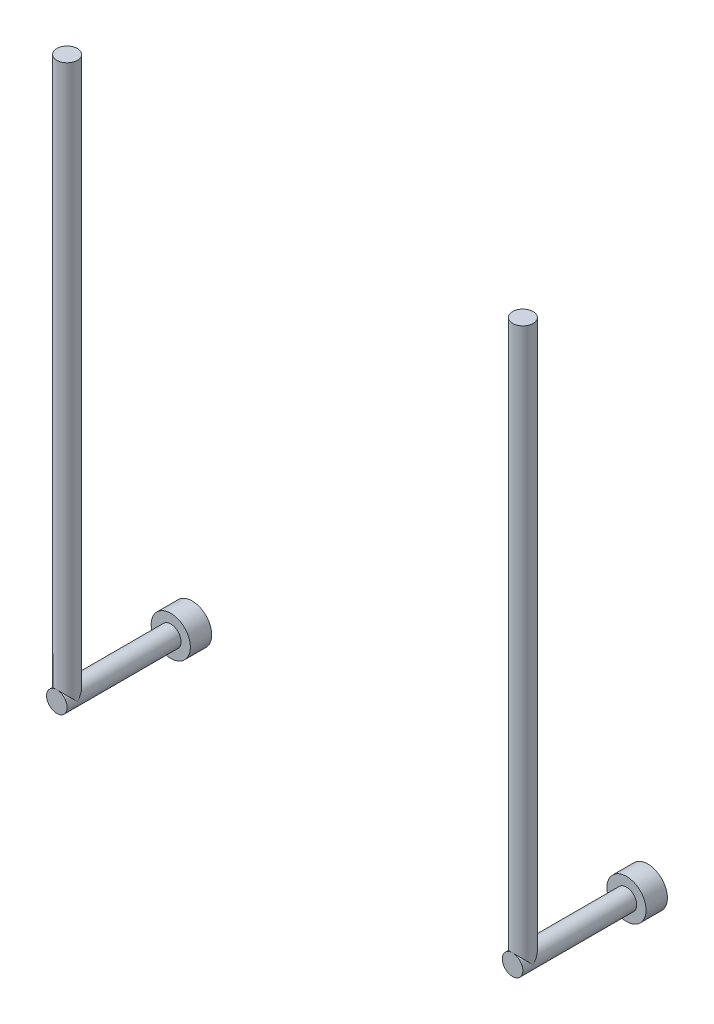
ISO-10303-21;
HEADER;
FILE_DESCRIPTION(('STEP AP214'),'2;1');
FILE_NAME('part.step','',(''),(''),'','','');
FILE_SCHEMA(('AUTOMOTIVE_DESIGN { 1 0 10303 214 1 1 1 1 }'));
ENDSEC;
DATA;
#1=APPLICATION_CONTEXT('core data for automotive mechanical design processes');
#2=APPLICATION_PROTOCOL_DEFINITION('international standard','automotive_design',2000,#1);
#3=PRODUCT_CONTEXT('',#1,'mechanical');
#4=PRODUCT('Part','Part','',(#3));
#5=PRODUCT_RELATED_PRODUCT_CATEGORY('part','',(#4));
#6=PRODUCT_DEFINITION_FORMATION('','',#4);
#7=PRODUCT_DEFINITION_CONTEXT('part definition',#1,'design');
#8=PRODUCT_DEFINITION('design','',#6,#7);
#9=PRODUCT_DEFINITION_SHAPE('','',#8);
#10=(LENGTH_UNIT() NAMED_UNIT(*) SI_UNIT(.MILLI.,.METRE.));
#11=(NAMED_UNIT(*) PLANE_ANGLE_UNIT() SI_UNIT($,.RADIAN.));
#12=(NAMED_UNIT(*) SI_UNIT($,.STERADIAN.) SOLID_ANGLE_UNIT());
#13=UNCERTAINTY_MEASURE_WITH_UNIT(LENGTH_MEASURE(1.E-05),#10,'distance_accuracy_value','');
#14=(GEOMETRIC_REPRESENTATION_CONTEXT(3) GLOBAL_UNCERTAINTY_ASSIGNED_CONTEXT((#13)) GLOBAL_UNIT_ASSIGNED_CONTEXT((#10,
#11,#12)) REPRESENTATION_CONTEXT('',''));
#15=CARTESIAN_POINT('',(0.,0.,0.));
#16=DIRECTION('',(0.,0.,1.));
#17=DIRECTION('',(1.,0.,0.));
#18=AXIS2_PLACEMENT_3D('',#15,#16,#17);
#19=CARTESIAN_POINT('',(32.,58.,31.85625));
#20=DIRECTION('',(0.,-1.,0.));
#21=DIRECTION('',(0.,0.,-1.));
#22=AXIS2_PLACEMENT_3D('',#19,#20,#21);
#23=CYLINDRICAL_SURFACE('',#22,1.44375);
#24=CARTESIAN_POINT('',(32.,58.,31.85625));
#25=DIRECTION('',(0.,1.,0.));
#26=DIRECTION('',(0.,0.,1.));
#27=AXIS2_PLACEMENT_3D('',#24,#25,#26);
#28=CIRCLE('',#27,1.44375);
#29=CARTESIAN_POINT('',(32.,58.,33.3));
#30=VERTEX_POINT('',#29);
#31=EDGE_CURVE('E11',#30,#30,#28,.T.);
#32=ORIENTED_EDGE('',*,*,#31,.F.);
#33=EDGE_LOOP('',(#32));
#34=FACE_BOUND('',#33,.T.);
#35=CARTESIAN_POINT('',(32.,-20.,31.85625));
#36=DIRECTION('',(0.,1.,0.));
#37=DIRECTION('',(0.,0.,1.));
#38=AXIS2_PLACEMENT_3D('',#35,#36,#37);
#39=CIRCLE('',#38,1.44375);
#40=CARTESIAN_POINT('',(32.,-20.,33.3));
#41=VERTEX_POINT('',#40);
#42=EDGE_CURVE('E49',#41,#41,#39,.T.);
#43=ORIENTED_EDGE('',*,*,#42,.T.);
#44=EDGE_LOOP('',(#43));
#45=FACE_BOUND('',#44,.T.);
#46=ADVANCED_FACE('F46',(#34,#45),#23,.T.);
#47=CARTESIAN_POINT('',(32.,58.,31.85625));
#48=DIRECTION('',(0.,1.,0.));
#49=DIRECTION('',(0.,0.,1.));
#50=AXIS2_PLACEMENT_3D('',#47,#48,#49);
#51=PLANE('',#50);
#52=ORIENTED_EDGE('',*,*,#31,.T.);
#53=EDGE_LOOP('',(#52));
#54=FACE_BOUND('',#53,.T.);
#55=ADVANCED_FACE('F61',(#54),#51,.T.);
#56=CARTESIAN_POINT('',(32.,-20.,31.85625));
#57=DIRECTION('',(0.,1.,0.));
#58=DIRECTION('',(0.,0.,1.));
#59=AXIS2_PLACEMENT_3D('',#56,#57,#58);
#60=PLANE('',#59);
#61=ORIENTED_EDGE('',*,*,#42,.F.);
#62=EDGE_LOOP('',(#61));
#63=FACE_BOUND('',#62,.T.);
#64=ADVANCED_FACE('F59',(#63),#60,.F.);
#65=CLOSED_SHELL('',(#46,#55,#64));
#66=MANIFOLD_SOLID_BREP('B2',#65);
#67=CARTESIAN_POINT('',(32.,-20.,33.3));
#68=DIRECTION('',(0.,0.,-1.));
#69=DIRECTION('',(-1.,0.,0.));
#70=AXIS2_PLACEMENT_3D('',#67,#68,#69);
#71=CYLINDRICAL_SURFACE('',#70,1.44375);
#72=CARTESIAN_POINT('',(32.,-20.,33.3));
#73=DIRECTION('',(0.,0.,1.));
#74=DIRECTION('',(1.,0.,0.));
#75=AXIS2_PLACEMENT_3D('',#72,#73,#74);
#76=CIRCLE('',#75,1.44375);
#77=CARTESIAN_POINT('',(33.44375,-20.,33.3));
#78=VERTEX_POINT('',#77);
#79=EDGE_CURVE('E45',#78,#78,#76,.T.);
#80=ORIENTED_EDGE('',*,*,#79,.F.);
#81=EDGE_LOOP('',(#80));
#82=FACE_BOUND('',#81,.T.);
#83=CARTESIAN_POINT('',(32.,-20.,15.31));
#84=DIRECTION('',(0.,0.,1.));
#85=DIRECTION('',(1.,0.,0.));
#86=AXIS2_PLACEMENT_3D('',#83,#84,#85);
#87=CIRCLE('',#86,1.44375);
#88=CARTESIAN_POINT('',(33.44375,-20.,15.31));
#89=VERTEX_POINT('',#88);
#90=EDGE_CURVE('E98',#89,#89,#87,.T.);
#91=ORIENTED_EDGE('',*,*,#90,.T.);
#92=EDGE_LOOP('',(#91));
#93=FACE_BOUND('',#92,.T.);
#94=ADVANCED_FACE('F95',(#82,#93),#71,.T.);
#95=CARTESIAN_POINT('',(32.,-20.,33.3));
#96=DIRECTION('',(0.,0.,1.));
#97=DIRECTION('',(1.,0.,0.));
#98=AXIS2_PLACEMENT_3D('',#95,#96,#97);
#99=PLANE('',#98);
#100=ORIENTED_EDGE('',*,*,#79,.T.);
#101=EDGE_LOOP('',(#100));
#102=FACE_BOUND('',#101,.T.);
#103=ADVANCED_FACE('F110',(#102),#99,.T.);
#104=CARTESIAN_POINT('',(32.,-20.,15.31));
#105=DIRECTION('',(0.,0.,1.));
#106=DIRECTION('',(1.,0.,0.));
#107=AXIS2_PLACEMENT_3D('',#104,#105,#106);
#108=PLANE('',#107);
#109=ORIENTED_EDGE('',*,*,#90,.F.);
#110=EDGE_LOOP('',(#109));
#111=FACE_BOUND('',#110,.T.);
#112=ADVANCED_FACE('F108',(#111),#108,.F.);
#113=CLOSED_SHELL('',(#94,#103,#112));
#114=MANIFOLD_SOLID_BREP('B6',#113);
#115=CARTESIAN_POINT('',(32.,-20.,17.3));
#116=DIRECTION('',(0.,0.,-1.));
#117=DIRECTION('',(-1.,0.,0.));
#118=AXIS2_PLACEMENT_3D('',#115,#116,#117);
#119=CYLINDRICAL_SURFACE('',#118,2.75);
#120=CARTESIAN_POINT('',(32.,-20.,17.3));
#121=DIRECTION('',(0.,0.,1.));
#122=DIRECTION('',(1.,0.,0.));
#123=AXIS2_PLACEMENT_3D('',#120,#121,#122);
#124=CIRCLE('',#123,2.75);
#125=CARTESIAN_POINT('',(34.75,-20.,17.3));
#126=VERTEX_POINT('',#125);
#127=EDGE_CURVE('E94',#126,#126,#124,.T.);
#128=ORIENTED_EDGE('',*,*,#127,.F.);
#129=EDGE_LOOP('',(#128));
#130=FACE_BOUND('',#129,.T.);
#131=CARTESIAN_POINT('',(32.,-20.,14.3));
#132=DIRECTION('',(0.,0.,1.));
#133=DIRECTION('',(1.,0.,0.));
#134=AXIS2_PLACEMENT_3D('',#131,#132,#133);
#135=CIRCLE('',#134,2.75);
#136=CARTESIAN_POINT('',(34.75,-20.,14.3));
#137=VERTEX_POINT('',#136);
#138=EDGE_CURVE('E147',#137,#137,#135,.T.);
#139=ORIENTED_EDGE('',*,*,#138,.T.);
#140=EDGE_LOOP('',(#139));
#141=FACE_BOUND('',#140,.T.);
#142=ADVANCED_FACE('F144',(#130,#141),#119,.T.);
#143=CARTESIAN_POINT('',(32.,-20.,17.3));
#144=DIRECTION('',(0.,0.,1.));
#145=DIRECTION('',(1.,0.,0.));
#146=AXIS2_PLACEMENT_3D('',#143,#144,#145);
#147=PLANE('',#146);
#148=ORIENTED_EDGE('',*,*,#127,.T.);
#149=EDGE_LOOP('',(#148));
#150=FACE_BOUND('',#149,.T.);
#151=ADVANCED_FACE('F159',(#150),#147,.T.);
#152=CARTESIAN_POINT('',(32.,-20.,14.3));
#153=DIRECTION('',(0.,0.,1.));
#154=DIRECTION('',(1.,0.,0.));
#155=AXIS2_PLACEMENT_3D('',#152,#153,#154);
#156=PLANE('',#155);
#157=ORIENTED_EDGE('',*,*,#138,.F.);
#158=EDGE_LOOP('',(#157));
#159=FACE_BOUND('',#158,.T.);
#160=ADVANCED_FACE('F157',(#159),#156,.F.);
#161=CLOSED_SHELL('',(#142,#151,#160));
#162=MANIFOLD_SOLID_BREP('B40',#161);
#163=CARTESIAN_POINT('',(-32.,58.,31.85625));
#164=DIRECTION('',(0.,-1.,0.));
#165=DIRECTION('',(0.,0.,-1.));
#166=AXIS2_PLACEMENT_3D('',#163,#164,#165);
#167=CYLINDRICAL_SURFACE('',#166,1.44375);
#168=CARTESIAN_POINT('',(-32.,58.,31.85625));
#169=DIRECTION('',(0.,1.,0.));
#170=DIRECTION('',(0.,0.,1.));
#171=AXIS2_PLACEMENT_3D('',#168,#169,#170);
#172=CIRCLE('',#171,1.44375);
#173=CARTESIAN_POINT('',(-32.,58.,33.3));
#174=VERTEX_POINT('',#173);
#175=EDGE_CURVE('E143',#174,#174,#172,.T.);
#176=ORIENTED_EDGE('',*,*,#175,.F.);
#177=EDGE_LOOP('',(#176));
#178=FACE_BOUND('',#177,.T.);
#179=CARTESIAN_POINT('',(-32.,-20.,31.85625));
#180=DIRECTION('',(0.,1.,0.));
#181=DIRECTION('',(0.,0.,1.));
#182=AXIS2_PLACEMENT_3D('',#179,#180,#181);
#183=CIRCLE('',#182,1.44375);
#184=CARTESIAN_POINT('',(-32.,-20.,33.3));
#185=VERTEX_POINT('',#184);
#186=EDGE_CURVE('E196',#185,#185,#183,.T.);
#187=ORIENTED_EDGE('',*,*,#186,.T.);
#188=EDGE_LOOP('',(#187));
#189=FACE_BOUND('',#188,.T.);
#190=ADVANCED_FACE('F193',(#178,#189),#167,.T.);
#191=CARTESIAN_POINT('',(-32.,58.,31.85625));
#192=DIRECTION('',(0.,1.,0.));
#193=DIRECTION('',(0.,0.,1.));
#194=AXIS2_PLACEMENT_3D('',#191,#192,#193);
#195=PLANE('',#194);
#196=ORIENTED_EDGE('',*,*,#175,.T.);
#197=EDGE_LOOP('',(#196));
#198=FACE_BOUND('',#197,.T.);
#199=ADVANCED_FACE('F208',(#198),#195,.T.);
#200=CARTESIAN_POINT('',(-32.,-20.,31.85625));
#201=DIRECTION('',(0.,1.,0.));
#202=DIRECTION('',(0.,0.,1.));
#203=AXIS2_PLACEMENT_3D('',#200,#201,#202);
#204=PLANE('',#203);
#205=ORIENTED_EDGE('',*,*,#186,.F.);
#206=EDGE_LOOP('',(#205));
#207=FACE_BOUND('',#206,.T.);
#208=ADVANCED_FACE('F206',(#207),#204,.F.);
#209=CLOSED_SHELL('',(#190,#199,#208));
#210=MANIFOLD_SOLID_BREP('B89',#209);
#211=CARTESIAN_POINT('',(-32.,-20.,33.3));
#212=DIRECTION('',(0.,0.,-1.));
#213=DIRECTION('',(-1.,0.,0.));
#214=AXIS2_PLACEMENT_3D('',#211,#212,#213);
#215=CYLINDRICAL_SURFACE('',#214,1.44375);
#216=CARTESIAN_POINT('',(-32.,-20.,33.3));
#217=DIRECTION('',(0.,0.,1.));
#218=DIRECTION('',(1.,0.,0.));
#219=AXIS2_PLACEMENT_3D('',#216,#217,#218);
#220=CIRCLE('',#219,1.44375);
#221=CARTESIAN_POINT('',(-30.55625,-20.,33.3));
#222=VERTEX_POINT('',#221);
#223=EDGE_CURVE('E192',#222,#222,#220,.T.);
#224=ORIENTED_EDGE('',*,*,#223,.F.);
#225=EDGE_LOOP('',(#224));
#226=FACE_BOUND('',#225,.T.);
#227=CARTESIAN_POINT('',(-32.,-20.,15.31));
#228=DIRECTION('',(0.,0.,1.));
#229=DIRECTION('',(1.,0.,0.));
#230=AXIS2_PLACEMENT_3D('',#227,#228,#229);
#231=CIRCLE('',#230,1.44375);
#232=CARTESIAN_POINT('',(-30.55625,-20.,15.31));
#233=VERTEX_POINT('',#232);
#234=EDGE_CURVE('E244',#233,#233,#231,.T.);
#235=ORIENTED_EDGE('',*,*,#234,.T.);
#236=EDGE_LOOP('',(#235));
#237=FACE_BOUND('',#236,.T.);
#238=ADVANCED_FACE('F241',(#226,#237),#215,.T.);
#239=CARTESIAN_POINT('',(-32.,-20.,33.3));
#240=DIRECTION('',(0.,0.,1.));
#241=DIRECTION('',(1.,0.,0.));
#242=AXIS2_PLACEMENT_3D('',#239,#240,#241);
#243=PLANE('',#242);
#244=ORIENTED_EDGE('',*,*,#223,.T.);
#245=EDGE_LOOP('',(#244));
#246=FACE_BOUND('',#245,.T.);
#247=ADVANCED_FACE('F256',(#246),#243,.T.);
#248=CARTESIAN_POINT('',(-32.,-20.,15.31));
#249=DIRECTION('',(0.,0.,1.));
#250=DIRECTION('',(1.,0.,0.));
#251=AXIS2_PLACEMENT_3D('',#248,#249,#250);
#252=PLANE('',#251);
#253=ORIENTED_EDGE('',*,*,#234,.F.);
#254=EDGE_LOOP('',(#253));
#255=FACE_BOUND('',#254,.T.);
#256=ADVANCED_FACE('F254',(#255),#252,.F.);
#257=CLOSED_SHELL('',(#238,#247,#256));
#258=MANIFOLD_SOLID_BREP('B138',#257);
#259=CARTESIAN_POINT('',(-32.,-20.,17.3));
#260=DIRECTION('',(0.,0.,-1.));
#261=DIRECTION('',(-1.,0.,0.));
#262=AXIS2_PLACEMENT_3D('',#259,#260,#261);
#263=CYLINDRICAL_SURFACE('',#262,2.75);
#264=CARTESIAN_POINT('',(-32.,-20.,17.3));
#265=DIRECTION('',(0.,0.,1.));
#266=DIRECTION('',(1.,0.,0.));
#267=AXIS2_PLACEMENT_3D('',#264,#265,#266);
#268=CIRCLE('',#267,2.75);
#269=CARTESIAN_POINT('',(-29.25,-20.,17.3));
#270=VERTEX_POINT('',#269);
#271=EDGE_CURVE('E240',#270,#270,#268,.T.);
#272=ORIENTED_EDGE('',*,*,#271,.F.);
#273=EDGE_LOOP('',(#272));
#274=FACE_BOUND('',#273,.T.);
#275=CARTESIAN_POINT('',(-32.,-20.,14.3));
#276=DIRECTION('',(0.,0.,1.));
#277=DIRECTION('',(1.,0.,0.));
#278=AXIS2_PLACEMENT_3D('',#275,#276,#277);
#279=CIRCLE('',#278,2.75);
#280=CARTESIAN_POINT('',(-29.25,-20.,14.3));
#281=VERTEX_POINT('',#280);
#282=EDGE_CURVE('E285',#281,#281,#279,.T.);
#283=ORIENTED_EDGE('',*,*,#282,.T.);
#284=EDGE_LOOP('',(#283));
#285=FACE_BOUND('',#284,.T.);
#286=ADVANCED_FACE('F282',(#274,#285),#263,.T.);
#287=CARTESIAN_POINT('',(-32.,-20.,17.3));
#288=DIRECTION('',(0.,0.,1.));
#289=DIRECTION('',(1.,0.,0.));
#290=AXIS2_PLACEMENT_3D('',#287,#288,#289);
#291=PLANE('',#290);
#292=ORIENTED_EDGE('',*,*,#271,.T.);
#293=EDGE_LOOP('',(#292));
#294=FACE_BOUND('',#293,.T.);
#295=ADVANCED_FACE('F297',(#294),#291,.T.);
#296=CARTESIAN_POINT('',(-32.,-20.,14.3));
#297=DIRECTION('',(0.,0.,1.));
#298=DIRECTION('',(1.,0.,0.));
#299=AXIS2_PLACEMENT_3D('',#296,#297,#298);
#300=PLANE('',#299);
#301=ORIENTED_EDGE('',*,*,#282,.F.);
#302=EDGE_LOOP('',(#301));
#303=FACE_BOUND('',#302,.T.);
#304=ADVANCED_FACE('F295',(#303),#300,.F.);
#305=CLOSED_SHELL('',(#286,#295,#304));
#306=MANIFOLD_SOLID_BREP('B187',#305);
#307=ADVANCED_BREP_SHAPE_REPRESENTATION('',(#18,#66,#114,#162,#210,#258,#306),#14);
#308=SHAPE_DEFINITION_REPRESENTATION(#9,#307);
ENDSEC;
END-ISO-10303-21;
